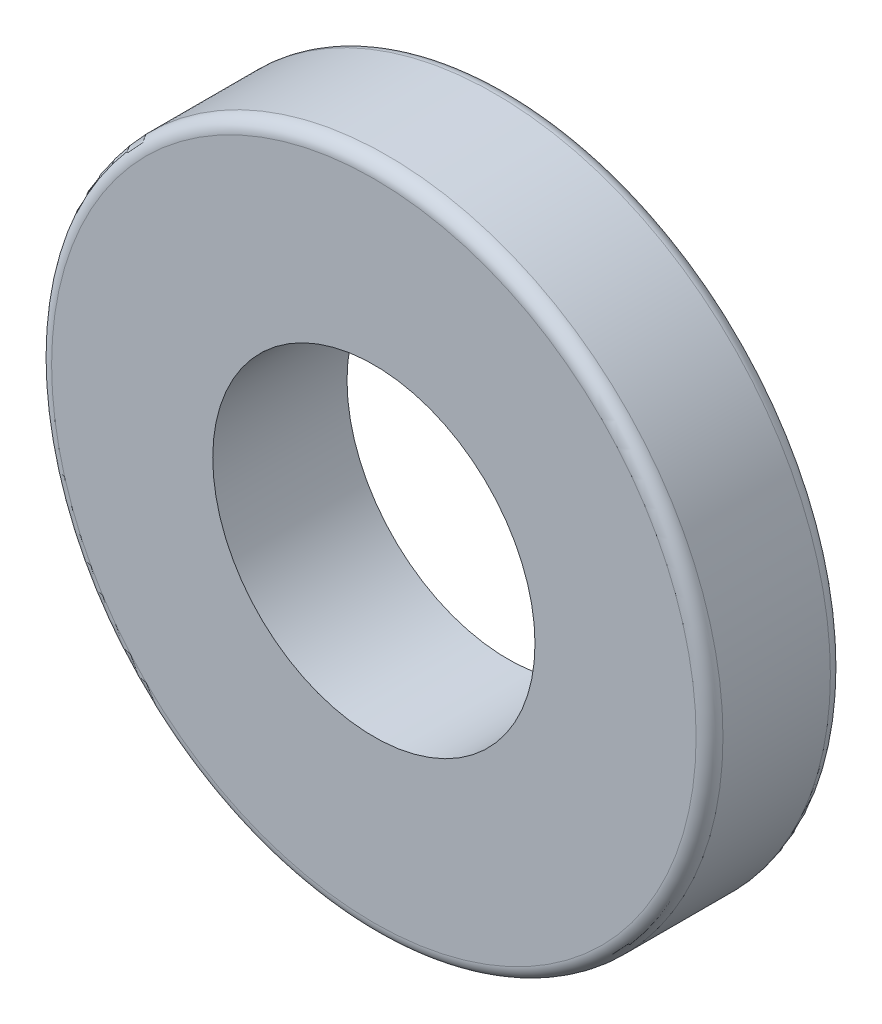
ISO-10303-21;
HEADER;
FILE_DESCRIPTION(('STEP AP214'),'2;1');
FILE_NAME('part.step','',(''),(''),'','','');
FILE_SCHEMA(('AUTOMOTIVE_DESIGN { 1 0 10303 214 1 1 1 1 }'));
ENDSEC;
DATA;
#1=APPLICATION_CONTEXT('core data for automotive mechanical design processes');
#2=APPLICATION_PROTOCOL_DEFINITION('international standard','automotive_design',2000,#1);
#3=PRODUCT_CONTEXT('',#1,'mechanical');
#4=PRODUCT('Part','Part','',(#3));
#5=PRODUCT_RELATED_PRODUCT_CATEGORY('part','',(#4));
#6=PRODUCT_DEFINITION_FORMATION('','',#4);
#7=PRODUCT_DEFINITION_CONTEXT('part definition',#1,'design');
#8=PRODUCT_DEFINITION('design','',#6,#7);
#9=PRODUCT_DEFINITION_SHAPE('','',#8);
#10=(LENGTH_UNIT() NAMED_UNIT(*) SI_UNIT(.MILLI.,.METRE.));
#11=(NAMED_UNIT(*) PLANE_ANGLE_UNIT() SI_UNIT($,.RADIAN.));
#12=(NAMED_UNIT(*) SI_UNIT($,.STERADIAN.) SOLID_ANGLE_UNIT());
#13=UNCERTAINTY_MEASURE_WITH_UNIT(LENGTH_MEASURE(1.E-05),#10,'distance_accuracy_value','');
#14=(GEOMETRIC_REPRESENTATION_CONTEXT(3) GLOBAL_UNCERTAINTY_ASSIGNED_CONTEXT((#13)) GLOBAL_UNIT_ASSIGNED_CONTEXT((#10,
#11,#12)) REPRESENTATION_CONTEXT('',''));
#15=CARTESIAN_POINT('',(0.,0.,0.));
#16=DIRECTION('',(0.,0.,1.));
#17=DIRECTION('',(1.,0.,0.));
#18=AXIS2_PLACEMENT_3D('',#15,#16,#17);
#19=CARTESIAN_POINT('',(0.,0.,2.54));
#20=DIRECTION('',(0.,0.,-1.));
#21=DIRECTION('',(-1.,0.,0.));
#22=AXIS2_PLACEMENT_3D('',#19,#20,#21);
#23=CYLINDRICAL_SURFACE('',#22,6.35);
#24=CARTESIAN_POINT('',(0.,0.,0.254));
#25=DIRECTION('',(0.,0.,1.));
#26=DIRECTION('',(1.,0.,0.));
#27=AXIS2_PLACEMENT_3D('',#24,#25,#26);
#28=CIRCLE('',#27,6.35);
#29=CARTESIAN_POINT('',(6.35,0.,0.254));
#30=VERTEX_POINT('',#29);
#31=EDGE_CURVE('E42',#30,#30,#28,.T.);
#32=ORIENTED_EDGE('',*,*,#31,.T.);
#33=EDGE_LOOP('',(#32));
#34=FACE_BOUND('',#33,.T.);
#35=CARTESIAN_POINT('',(0.,0.,2.286));
#36=DIRECTION('',(0.,0.,1.));
#37=DIRECTION('',(1.,0.,0.));
#38=AXIS2_PLACEMENT_3D('',#35,#36,#37);
#39=CIRCLE('',#38,6.35);
#40=CARTESIAN_POINT('',(6.35,0.,2.286));
#41=VERTEX_POINT('',#40);
#42=EDGE_CURVE('E46',#41,#41,#39,.F.);
#43=ORIENTED_EDGE('',*,*,#42,.T.);
#44=EDGE_LOOP('',(#43));
#45=FACE_BOUND('',#44,.T.);
#46=ADVANCED_FACE('F31',(#34,#45),#23,.T.);
#47=CARTESIAN_POINT('',(0.,0.,2.54));
#48=DIRECTION('',(0.,0.,1.));
#49=DIRECTION('',(1.,0.,0.));
#50=AXIS2_PLACEMENT_3D('',#47,#48,#49);
#51=PLANE('',#50);
#52=CARTESIAN_POINT('',(0.,0.,2.54));
#53=DIRECTION('',(0.,0.,1.));
#54=DIRECTION('',(1.,0.,0.));
#55=AXIS2_PLACEMENT_3D('',#52,#53,#54);
#56=CIRCLE('',#55,6.096);
#57=CARTESIAN_POINT('',(6.096,0.,2.54));
#58=VERTEX_POINT('',#57);
#59=EDGE_CURVE('E10',#58,#58,#56,.T.);
#60=ORIENTED_EDGE('',*,*,#59,.T.);
#61=EDGE_LOOP('',(#60));
#62=FACE_BOUND('',#61,.T.);
#63=CARTESIAN_POINT('',(0.,0.,2.54));
#64=DIRECTION('',(0.,0.,1.));
#65=DIRECTION('',(1.,0.,0.));
#66=AXIS2_PLACEMENT_3D('',#63,#64,#65);
#67=CIRCLE('',#66,3.048);
#68=CARTESIAN_POINT('',(3.048,0.,2.54));
#69=VERTEX_POINT('',#68);
#70=EDGE_CURVE('E52',#69,#69,#67,.T.);
#71=ORIENTED_EDGE('',*,*,#70,.F.);
#72=EDGE_LOOP('',(#71));
#73=FACE_BOUND('',#72,.T.);
#74=ADVANCED_FACE('F67',(#62,#73),#51,.T.);
#75=CARTESIAN_POINT('',(0.,0.,0.));
#76=DIRECTION('',(0.,0.,1.));
#77=DIRECTION('',(1.,0.,0.));
#78=AXIS2_PLACEMENT_3D('',#75,#76,#77);
#79=PLANE('',#78);
#80=CARTESIAN_POINT('',(0.,0.,0.));
#81=DIRECTION('',(0.,0.,1.));
#82=DIRECTION('',(1.,0.,0.));
#83=AXIS2_PLACEMENT_3D('',#80,#81,#82);
#84=CIRCLE('',#83,6.096);
#85=CARTESIAN_POINT('',(6.096,0.,0.));
#86=VERTEX_POINT('',#85);
#87=EDGE_CURVE('E38',#86,#86,#84,.F.);
#88=ORIENTED_EDGE('',*,*,#87,.T.);
#89=EDGE_LOOP('',(#88));
#90=FACE_BOUND('',#89,.T.);
#91=CARTESIAN_POINT('',(0.,0.,0.));
#92=DIRECTION('',(0.,0.,1.));
#93=DIRECTION('',(1.,0.,0.));
#94=AXIS2_PLACEMENT_3D('',#91,#92,#93);
#95=CIRCLE('',#94,3.048);
#96=CARTESIAN_POINT('',(3.048,0.,0.));
#97=VERTEX_POINT('',#96);
#98=EDGE_CURVE('E51',#97,#97,#95,.T.);
#99=ORIENTED_EDGE('',*,*,#98,.T.);
#100=EDGE_LOOP('',(#99));
#101=FACE_BOUND('',#100,.T.);
#102=ADVANCED_FACE('F58',(#90,#101),#79,.F.);
#103=CARTESIAN_POINT('',(0.,0.,0.));
#104=DIRECTION('',(0.,0.,1.));
#105=DIRECTION('',(1.,0.,0.));
#106=AXIS2_PLACEMENT_3D('',#103,#104,#105);
#107=CYLINDRICAL_SURFACE('',#106,3.048);
#108=ORIENTED_EDGE('',*,*,#98,.F.);
#109=EDGE_LOOP('',(#108));
#110=FACE_BOUND('',#109,.T.);
#111=ORIENTED_EDGE('',*,*,#70,.T.);
#112=EDGE_LOOP('',(#111));
#113=FACE_BOUND('',#112,.T.);
#114=ADVANCED_FACE('F60',(#110,#113),#107,.F.);
#115=CARTESIAN_POINT('',(0.,0.,0.254));
#116=DIRECTION('',(0.,0.,1.));
#117=DIRECTION('',(1.,0.,0.));
#118=AXIS2_PLACEMENT_3D('',#115,#116,#117);
#119=TOROIDAL_SURFACE('',#118,6.096,0.254);
#120=ORIENTED_EDGE('',*,*,#87,.F.);
#121=EDGE_LOOP('',(#120));
#122=FACE_BOUND('',#121,.T.);
#123=ORIENTED_EDGE('',*,*,#31,.F.);
#124=EDGE_LOOP('',(#123));
#125=FACE_BOUND('',#124,.T.);
#126=ADVANCED_FACE('F63',(#122,#125),#119,.T.);
#127=CARTESIAN_POINT('',(0.,0.,2.286));
#128=DIRECTION('',(0.,0.,1.));
#129=DIRECTION('',(1.,0.,0.));
#130=AXIS2_PLACEMENT_3D('',#127,#128,#129);
#131=TOROIDAL_SURFACE('',#130,6.096,0.254);
#132=ORIENTED_EDGE('',*,*,#42,.F.);
#133=EDGE_LOOP('',(#132));
#134=FACE_BOUND('',#133,.T.);
#135=ORIENTED_EDGE('',*,*,#59,.F.);
#136=EDGE_LOOP('',(#135));
#137=FACE_BOUND('',#136,.T.);
#138=ADVANCED_FACE('F33',(#134,#137),#131,.T.);
#139=CLOSED_SHELL('',(#46,#74,#102,#114,#126,#138));
#140=MANIFOLD_SOLID_BREP('B2',#139);
#141=ADVANCED_BREP_SHAPE_REPRESENTATION('',(#18,#140),#14);
#142=SHAPE_DEFINITION_REPRESENTATION(#9,#141);
ENDSEC;
END-ISO-10303-21;
